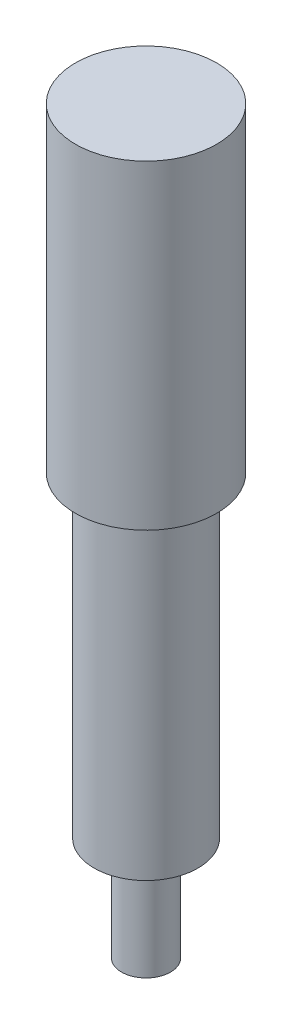
ISO-10303-21;
HEADER;
FILE_DESCRIPTION(('STEP AP214'),'2;1');
FILE_NAME('part.step','',(''),(''),'','','');
FILE_SCHEMA(('AUTOMOTIVE_DESIGN { 1 0 10303 214 1 1 1 1 }'));
ENDSEC;
DATA;
#1=APPLICATION_CONTEXT('core data for automotive mechanical design processes');
#2=APPLICATION_PROTOCOL_DEFINITION('international standard','automotive_design',2000,#1);
#3=PRODUCT_CONTEXT('',#1,'mechanical');
#4=PRODUCT('Part','Part','',(#3));
#5=PRODUCT_RELATED_PRODUCT_CATEGORY('part','',(#4));
#6=PRODUCT_DEFINITION_FORMATION('','',#4);
#7=PRODUCT_DEFINITION_CONTEXT('part definition',#1,'design');
#8=PRODUCT_DEFINITION('design','',#6,#7);
#9=PRODUCT_DEFINITION_SHAPE('','',#8);
#10=(LENGTH_UNIT() NAMED_UNIT(*) SI_UNIT(.MILLI.,.METRE.));
#11=(NAMED_UNIT(*) PLANE_ANGLE_UNIT() SI_UNIT($,.RADIAN.));
#12=(NAMED_UNIT(*) SI_UNIT($,.STERADIAN.) SOLID_ANGLE_UNIT());
#13=UNCERTAINTY_MEASURE_WITH_UNIT(LENGTH_MEASURE(1.E-05),#10,'distance_accuracy_value','');
#14=(GEOMETRIC_REPRESENTATION_CONTEXT(3) GLOBAL_UNCERTAINTY_ASSIGNED_CONTEXT((#13)) GLOBAL_UNIT_ASSIGNED_CONTEXT((#10,
#11,#12)) REPRESENTATION_CONTEXT('',''));
#15=CARTESIAN_POINT('',(0.,0.,0.));
#16=DIRECTION('',(0.,0.,1.));
#17=DIRECTION('',(1.,0.,0.));
#18=AXIS2_PLACEMENT_3D('',#15,#16,#17);
#19=CARTESIAN_POINT('',(0.,0.,0.));
#20=DIRECTION('',(0.,-1.,0.));
#21=DIRECTION('',(0.,0.,-1.));
#22=AXIS2_PLACEMENT_3D('',#19,#20,#21);
#23=PLANE('',#22);
#24=CARTESIAN_POINT('',(0.,0.,0.));
#25=DIRECTION('',(0.,-1.,0.));
#26=DIRECTION('',(0.,0.,-1.));
#27=AXIS2_PLACEMENT_3D('',#24,#25,#26);
#28=CIRCLE('',#27,5.999999938);
#29=CARTESIAN_POINT('',(0.,0.,-5.999999938));
#30=VERTEX_POINT('',#29);
#31=EDGE_CURVE('E10',#30,#30,#28,.T.);
#32=ORIENTED_EDGE('',*,*,#31,.T.);
#33=EDGE_LOOP('',(#32));
#34=FACE_BOUND('',#33,.T.);
#35=ADVANCED_FACE('F45',(#34),#23,.T.);
#36=CARTESIAN_POINT('',(0.,0.,0.));
#37=DIRECTION('',(0.,-1.,0.));
#38=DIRECTION('',(0.,0.,-1.));
#39=AXIS2_PLACEMENT_3D('',#36,#37,#38);
#40=CYLINDRICAL_SURFACE('',#39,5.999999938);
#41=CARTESIAN_POINT('',(0.,25.4,0.));
#42=DIRECTION('',(0.,-1.,0.));
#43=DIRECTION('',(0.,0.,-1.));
#44=AXIS2_PLACEMENT_3D('',#41,#42,#43);
#45=CIRCLE('',#44,5.99999993799999);
#46=CARTESIAN_POINT('',(0.,25.4,-5.99999993799999));
#47=VERTEX_POINT('',#46);
#48=EDGE_CURVE('E51',#47,#47,#45,.T.);
#49=ORIENTED_EDGE('',*,*,#48,.T.);
#50=EDGE_LOOP('',(#49));
#51=FACE_BOUND('',#50,.T.);
#52=ORIENTED_EDGE('',*,*,#31,.F.);
#53=EDGE_LOOP('',(#52));
#54=FACE_BOUND('',#53,.T.);
#55=ADVANCED_FACE('F83',(#51,#54),#40,.T.);
#56=CARTESIAN_POINT('',(0.,25.4,0.));
#57=DIRECTION('',(0.,-1.,0.));
#58=DIRECTION('',(0.,0.,-1.));
#59=AXIS2_PLACEMENT_3D('',#56,#57,#58);
#60=PLANE('',#59);
#61=CARTESIAN_POINT('',(0.,25.4,0.));
#62=DIRECTION('',(0.,-1.,0.));
#63=DIRECTION('',(0.,0.,-1.));
#64=AXIS2_PLACEMENT_3D('',#61,#62,#63);
#65=CIRCLE('',#64,12.720955);
#66=CARTESIAN_POINT('',(0.,25.4,-12.720955));
#67=VERTEX_POINT('',#66);
#68=EDGE_CURVE('E55',#67,#67,#65,.T.);
#69=ORIENTED_EDGE('',*,*,#68,.T.);
#70=EDGE_LOOP('',(#69));
#71=FACE_BOUND('',#70,.T.);
#72=ORIENTED_EDGE('',*,*,#48,.F.);
#73=EDGE_LOOP('',(#72));
#74=FACE_BOUND('',#73,.T.);
#75=ADVANCED_FACE('F87',(#71,#74),#60,.T.);
#76=CARTESIAN_POINT('',(0.,0.,0.));
#77=DIRECTION('',(0.,-1.,0.));
#78=DIRECTION('',(0.,0.,-1.));
#79=AXIS2_PLACEMENT_3D('',#76,#77,#78);
#80=CYLINDRICAL_SURFACE('',#79,12.720955);
#81=CARTESIAN_POINT('',(0.,102.87,0.));
#82=DIRECTION('',(0.,-1.,0.));
#83=DIRECTION('',(0.,0.,-1.));
#84=AXIS2_PLACEMENT_3D('',#81,#82,#83);
#85=CIRCLE('',#84,12.720955);
#86=CARTESIAN_POINT('',(0.,102.87,-12.720955));
#87=VERTEX_POINT('',#86);
#88=EDGE_CURVE('E59',#87,#87,#85,.T.);
#89=ORIENTED_EDGE('',*,*,#88,.T.);
#90=EDGE_LOOP('',(#89));
#91=FACE_BOUND('',#90,.T.);
#92=ORIENTED_EDGE('',*,*,#68,.F.);
#93=EDGE_LOOP('',(#92));
#94=FACE_BOUND('',#93,.T.);
#95=ADVANCED_FACE('F91',(#91,#94),#80,.T.);
#96=CARTESIAN_POINT('',(0.,102.87,0.));
#97=DIRECTION('',(0.,-1.,0.));
#98=DIRECTION('',(0.,0.,-1.));
#99=AXIS2_PLACEMENT_3D('',#96,#97,#98);
#100=PLANE('',#99);
#101=CARTESIAN_POINT('',(0.,102.87,0.));
#102=DIRECTION('',(0.,-1.,0.));
#103=DIRECTION('',(0.,0.,-1.));
#104=AXIS2_PLACEMENT_3D('',#101,#102,#103);
#105=CIRCLE('',#104,17.272);
#106=CARTESIAN_POINT('',(0.,102.87,-17.272));
#107=VERTEX_POINT('',#106);
#108=EDGE_CURVE('E64',#107,#107,#105,.T.);
#109=ORIENTED_EDGE('',*,*,#108,.T.);
#110=EDGE_LOOP('',(#109));
#111=FACE_BOUND('',#110,.T.);
#112=ORIENTED_EDGE('',*,*,#88,.F.);
#113=EDGE_LOOP('',(#112));
#114=FACE_BOUND('',#113,.T.);
#115=ADVANCED_FACE('F80',(#111,#114),#100,.T.);
#116=CARTESIAN_POINT('',(0.,0.,0.));
#117=DIRECTION('',(0.,-1.,0.));
#118=DIRECTION('',(0.,0.,-1.));
#119=AXIS2_PLACEMENT_3D('',#116,#117,#118);
#120=CYLINDRICAL_SURFACE('',#119,17.272);
#121=CARTESIAN_POINT('',(0.,181.102,0.));
#122=DIRECTION('',(0.,-1.,0.));
#123=DIRECTION('',(0.,0.,-1.));
#124=AXIS2_PLACEMENT_3D('',#121,#122,#123);
#125=CIRCLE('',#124,17.272);
#126=CARTESIAN_POINT('',(0.,181.102,-17.272));
#127=VERTEX_POINT('',#126);
#128=EDGE_CURVE('E67',#127,#127,#125,.T.);
#129=ORIENTED_EDGE('',*,*,#128,.T.);
#130=EDGE_LOOP('',(#129));
#131=FACE_BOUND('',#130,.T.);
#132=ORIENTED_EDGE('',*,*,#108,.F.);
#133=EDGE_LOOP('',(#132));
#134=FACE_BOUND('',#133,.T.);
#135=ADVANCED_FACE('F71',(#131,#134),#120,.T.);
#136=CARTESIAN_POINT('',(0.,181.102,0.));
#137=DIRECTION('',(0.,-1.,0.));
#138=DIRECTION('',(0.,0.,-1.));
#139=AXIS2_PLACEMENT_3D('',#136,#137,#138);
#140=PLANE('',#139);
#141=ORIENTED_EDGE('',*,*,#128,.F.);
#142=EDGE_LOOP('',(#141));
#143=FACE_BOUND('',#142,.T.);
#144=ADVANCED_FACE('F74',(#143),#140,.F.);
#145=CLOSED_SHELL('',(#35,#55,#75,#95,#115,#135,#144));
#146=MANIFOLD_SOLID_BREP('B2',#145);
#147=ADVANCED_BREP_SHAPE_REPRESENTATION('',(#18,#146),#14);
#148=SHAPE_DEFINITION_REPRESENTATION(#9,#147);
ENDSEC;
END-ISO-10303-21;
